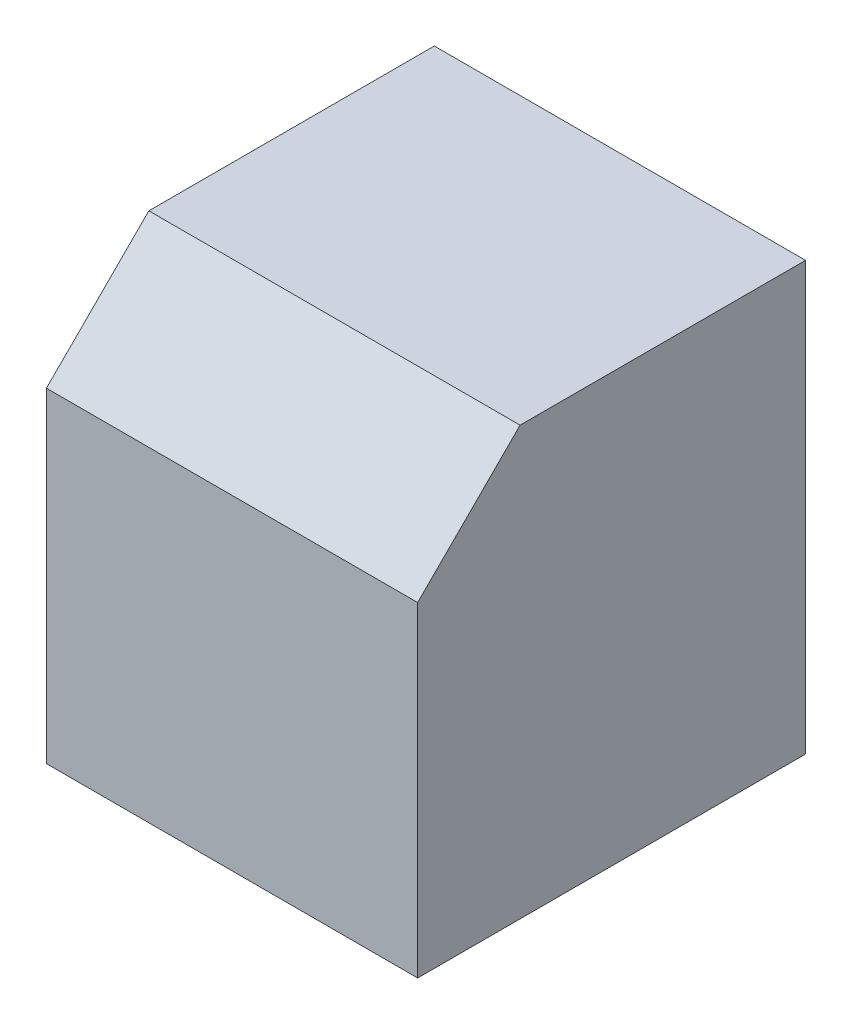
ISO-10303-21;
HEADER;
FILE_DESCRIPTION(('STEP AP214'),'2;1');
FILE_NAME('part.step','',(''),(''),'','','');
FILE_SCHEMA(('AUTOMOTIVE_DESIGN { 1 0 10303 214 1 1 1 1 }'));
ENDSEC;
DATA;
#1=APPLICATION_CONTEXT('core data for automotive mechanical design processes');
#2=APPLICATION_PROTOCOL_DEFINITION('international standard','automotive_design',2000,#1);
#3=PRODUCT_CONTEXT('',#1,'mechanical');
#4=PRODUCT('Part','Part','',(#3));
#5=PRODUCT_RELATED_PRODUCT_CATEGORY('part','',(#4));
#6=PRODUCT_DEFINITION_FORMATION('','',#4);
#7=PRODUCT_DEFINITION_CONTEXT('part definition',#1,'design');
#8=PRODUCT_DEFINITION('design','',#6,#7);
#9=PRODUCT_DEFINITION_SHAPE('','',#8);
#10=(LENGTH_UNIT() NAMED_UNIT(*) SI_UNIT(.MILLI.,.METRE.));
#11=(NAMED_UNIT(*) PLANE_ANGLE_UNIT() SI_UNIT($,.RADIAN.));
#12=(NAMED_UNIT(*) SI_UNIT($,.STERADIAN.) SOLID_ANGLE_UNIT());
#13=UNCERTAINTY_MEASURE_WITH_UNIT(LENGTH_MEASURE(1.E-05),#10,'distance_accuracy_value','');
#14=(GEOMETRIC_REPRESENTATION_CONTEXT(3) GLOBAL_UNCERTAINTY_ASSIGNED_CONTEXT((#13)) GLOBAL_UNIT_ASSIGNED_CONTEXT((#10,
#11,#12)) REPRESENTATION_CONTEXT('',''));
#15=CARTESIAN_POINT('',(0.,0.,0.));
#16=DIRECTION('',(0.,0.,1.));
#17=DIRECTION('',(1.,0.,0.));
#18=AXIS2_PLACEMENT_3D('',#15,#16,#17);
#19=CARTESIAN_POINT('',(0.,0.,30.3));
#20=DIRECTION('',(-1.,0.,0.));
#21=DIRECTION('',(0.,-1.,0.));
#22=AXIS2_PLACEMENT_3D('',#19,#20,#21);
#23=PLANE('',#22);
#24=DIRECTION('',(0.,-0.707106781186548,0.707106781186548));
#25=VECTOR('',#24,1.);
#26=CARTESIAN_POINT('',(0.,33.4,22.3));
#27=LINE('',#26,#25);
#28=CARTESIAN_POINT('',(0.,33.4,22.3));
#29=VERTEX_POINT('',#28);
#30=CARTESIAN_POINT('',(0.,25.4,30.3));
#31=VERTEX_POINT('',#30);
#32=EDGE_CURVE('E49',#29,#31,#27,.T.);
#33=ORIENTED_EDGE('',*,*,#32,.F.);
#34=DIRECTION('',(0.,0.,-1.));
#35=VECTOR('',#34,1.);
#36=CARTESIAN_POINT('',(0.,33.4,30.3));
#37=LINE('',#36,#35);
#38=CARTESIAN_POINT('',(0.,33.4,0.));
#39=VERTEX_POINT('',#38);
#40=EDGE_CURVE('E36',#29,#39,#37,.T.);
#41=ORIENTED_EDGE('',*,*,#40,.T.);
#42=DIRECTION('',(0.,1.,0.));
#43=VECTOR('',#42,1.);
#44=CARTESIAN_POINT('',(0.,0.,0.));
#45=LINE('',#44,#43);
#46=CARTESIAN_POINT('',(0.,0.,0.));
#47=VERTEX_POINT('',#46);
#48=EDGE_CURVE('E85',#47,#39,#45,.T.);
#49=ORIENTED_EDGE('',*,*,#48,.F.);
#50=DIRECTION('',(0.,0.,-1.));
#51=VECTOR('',#50,1.);
#52=CARTESIAN_POINT('',(0.,0.,30.3));
#53=LINE('',#52,#51);
#54=CARTESIAN_POINT('',(0.,0.,30.3));
#55=VERTEX_POINT('',#54);
#56=EDGE_CURVE('E11',#55,#47,#53,.T.);
#57=ORIENTED_EDGE('',*,*,#56,.F.);
#58=DIRECTION('',(0.,1.,0.));
#59=VECTOR('',#58,1.);
#60=CARTESIAN_POINT('',(0.,0.,30.3));
#61=LINE('',#60,#59);
#62=EDGE_CURVE('E88',#55,#31,#61,.T.);
#63=ORIENTED_EDGE('',*,*,#62,.T.);
#64=EDGE_LOOP('',(#33,#41,#49,#57,#63));
#65=FACE_BOUND('',#64,.T.);
#66=ADVANCED_FACE('F33',(#65),#23,.T.);
#67=CARTESIAN_POINT('',(0.,0.,30.3));
#68=DIRECTION('',(0.,1.,0.));
#69=DIRECTION('',(0.,0.,1.));
#70=AXIS2_PLACEMENT_3D('',#67,#68,#69);
#71=PLANE('',#70);
#72=DIRECTION('',(1.,0.,0.));
#73=VECTOR('',#72,1.);
#74=CARTESIAN_POINT('',(0.,0.,0.));
#75=LINE('',#74,#73);
#76=CARTESIAN_POINT('',(29.,0.,0.));
#77=VERTEX_POINT('',#76);
#78=EDGE_CURVE('E76',#47,#77,#75,.T.);
#79=ORIENTED_EDGE('',*,*,#78,.T.);
#80=DIRECTION('',(0.,0.,-1.));
#81=VECTOR('',#80,1.);
#82=CARTESIAN_POINT('',(29.,0.,30.3));
#83=LINE('',#82,#81);
#84=CARTESIAN_POINT('',(29.,0.,30.3));
#85=VERTEX_POINT('',#84);
#86=EDGE_CURVE('E41',#85,#77,#83,.T.);
#87=ORIENTED_EDGE('',*,*,#86,.F.);
#88=DIRECTION('',(1.,0.,0.));
#89=VECTOR('',#88,1.);
#90=CARTESIAN_POINT('',(0.,0.,30.3));
#91=LINE('',#90,#89);
#92=EDGE_CURVE('E78',#55,#85,#91,.T.);
#93=ORIENTED_EDGE('',*,*,#92,.F.);
#94=ORIENTED_EDGE('',*,*,#56,.T.);
#95=EDGE_LOOP('',(#79,#87,#93,#94));
#96=FACE_BOUND('',#95,.T.);
#97=ADVANCED_FACE('F74',(#96),#71,.F.);
#98=CARTESIAN_POINT('',(29.,0.,30.3));
#99=DIRECTION('',(-1.,0.,0.));
#100=DIRECTION('',(0.,-1.,0.));
#101=AXIS2_PLACEMENT_3D('',#98,#99,#100);
#102=PLANE('',#101);
#103=DIRECTION('',(0.,0.,-1.));
#104=VECTOR('',#103,1.);
#105=CARTESIAN_POINT('',(29.,33.4,30.3));
#106=LINE('',#105,#104);
#107=CARTESIAN_POINT('',(29.,33.4,22.3));
#108=VERTEX_POINT('',#107);
#109=CARTESIAN_POINT('',(29.,33.4,0.));
#110=VERTEX_POINT('',#109);
#111=EDGE_CURVE('E102',#108,#110,#106,.T.);
#112=ORIENTED_EDGE('',*,*,#111,.F.);
#113=DIRECTION('',(0.,-0.707106781186548,0.707106781186548));
#114=VECTOR('',#113,1.);
#115=CARTESIAN_POINT('',(29.,33.4,22.3));
#116=LINE('',#115,#114);
#117=CARTESIAN_POINT('',(29.,25.4,30.3));
#118=VERTEX_POINT('',#117);
#119=EDGE_CURVE('E112',#108,#118,#116,.T.);
#120=ORIENTED_EDGE('',*,*,#119,.T.);
#121=DIRECTION('',(0.,1.,0.));
#122=VECTOR('',#121,1.);
#123=CARTESIAN_POINT('',(29.,0.,30.3));
#124=LINE('',#123,#122);
#125=EDGE_CURVE('E106',#85,#118,#124,.T.);
#126=ORIENTED_EDGE('',*,*,#125,.F.);
#127=ORIENTED_EDGE('',*,*,#86,.T.);
#128=DIRECTION('',(0.,1.,0.));
#129=VECTOR('',#128,1.);
#130=CARTESIAN_POINT('',(29.,0.,0.));
#131=LINE('',#130,#129);
#132=EDGE_CURVE('E87',#77,#110,#131,.T.);
#133=ORIENTED_EDGE('',*,*,#132,.T.);
#134=EDGE_LOOP('',(#112,#120,#126,#127,#133));
#135=FACE_BOUND('',#134,.T.);
#136=ADVANCED_FACE('F118',(#135),#102,.F.);
#137=CARTESIAN_POINT('',(0.,33.4,30.3));
#138=DIRECTION('',(0.,1.,0.));
#139=DIRECTION('',(0.,0.,1.));
#140=AXIS2_PLACEMENT_3D('',#137,#138,#139);
#141=PLANE('',#140);
#142=DIRECTION('',(-1.,0.,0.));
#143=VECTOR('',#142,1.);
#144=CARTESIAN_POINT('',(29.,33.4,22.3));
#145=LINE('',#144,#143);
#146=EDGE_CURVE('E96',#108,#29,#145,.T.);
#147=ORIENTED_EDGE('',*,*,#146,.F.);
#148=ORIENTED_EDGE('',*,*,#111,.T.);
#149=DIRECTION('',(1.,0.,0.));
#150=VECTOR('',#149,1.);
#151=CARTESIAN_POINT('',(0.,33.4,0.));
#152=LINE('',#151,#150);
#153=EDGE_CURVE('E92',#39,#110,#152,.T.);
#154=ORIENTED_EDGE('',*,*,#153,.F.);
#155=ORIENTED_EDGE('',*,*,#40,.F.);
#156=EDGE_LOOP('',(#147,#148,#154,#155));
#157=FACE_BOUND('',#156,.T.);
#158=ADVANCED_FACE('F124',(#157),#141,.T.);
#159=CARTESIAN_POINT('',(0.,0.,30.3));
#160=DIRECTION('',(0.,0.,-1.));
#161=DIRECTION('',(-1.,0.,0.));
#162=AXIS2_PLACEMENT_3D('',#159,#160,#161);
#163=PLANE('',#162);
#164=ORIENTED_EDGE('',*,*,#125,.T.);
#165=DIRECTION('',(-1.,0.,0.));
#166=VECTOR('',#165,1.);
#167=CARTESIAN_POINT('',(29.,25.4,30.3));
#168=LINE('',#167,#166);
#169=EDGE_CURVE('E93',#118,#31,#168,.T.);
#170=ORIENTED_EDGE('',*,*,#169,.T.);
#171=ORIENTED_EDGE('',*,*,#62,.F.);
#172=ORIENTED_EDGE('',*,*,#92,.T.);
#173=EDGE_LOOP('',(#164,#170,#171,#172));
#174=FACE_BOUND('',#173,.T.);
#175=ADVANCED_FACE('F126',(#174),#163,.F.);
#176=CARTESIAN_POINT('',(0.,0.,0.));
#177=DIRECTION('',(0.,0.,-1.));
#178=DIRECTION('',(-1.,0.,0.));
#179=AXIS2_PLACEMENT_3D('',#176,#177,#178);
#180=PLANE('',#179);
#181=ORIENTED_EDGE('',*,*,#48,.T.);
#182=ORIENTED_EDGE('',*,*,#153,.T.);
#183=ORIENTED_EDGE('',*,*,#132,.F.);
#184=ORIENTED_EDGE('',*,*,#78,.F.);
#185=EDGE_LOOP('',(#181,#182,#183,#184));
#186=FACE_BOUND('',#185,.T.);
#187=ADVANCED_FACE('F83',(#186),#180,.T.);
#188=CARTESIAN_POINT('',(29.,33.4,22.3));
#189=DIRECTION('',(0.,-0.707106781186548,-0.707106781186548));
#190=DIRECTION('',(0.,0.707106781186548,-0.707106781186548));
#191=AXIS2_PLACEMENT_3D('',#188,#189,#190);
#192=PLANE('',#191);
#193=ORIENTED_EDGE('',*,*,#32,.T.);
#194=ORIENTED_EDGE('',*,*,#169,.F.);
#195=ORIENTED_EDGE('',*,*,#119,.F.);
#196=ORIENTED_EDGE('',*,*,#146,.T.);
#197=EDGE_LOOP('',(#193,#194,#195,#196));
#198=FACE_BOUND('',#197,.T.);
#199=ADVANCED_FACE('F121',(#198),#192,.F.);
#200=CLOSED_SHELL('',(#66,#97,#136,#158,#175,#187,#199));
#201=MANIFOLD_SOLID_BREP('B2',#200);
#202=ADVANCED_BREP_SHAPE_REPRESENTATION('',(#18,#201),#14);
#203=SHAPE_DEFINITION_REPRESENTATION(#9,#202);
ENDSEC;
END-ISO-10303-21;
